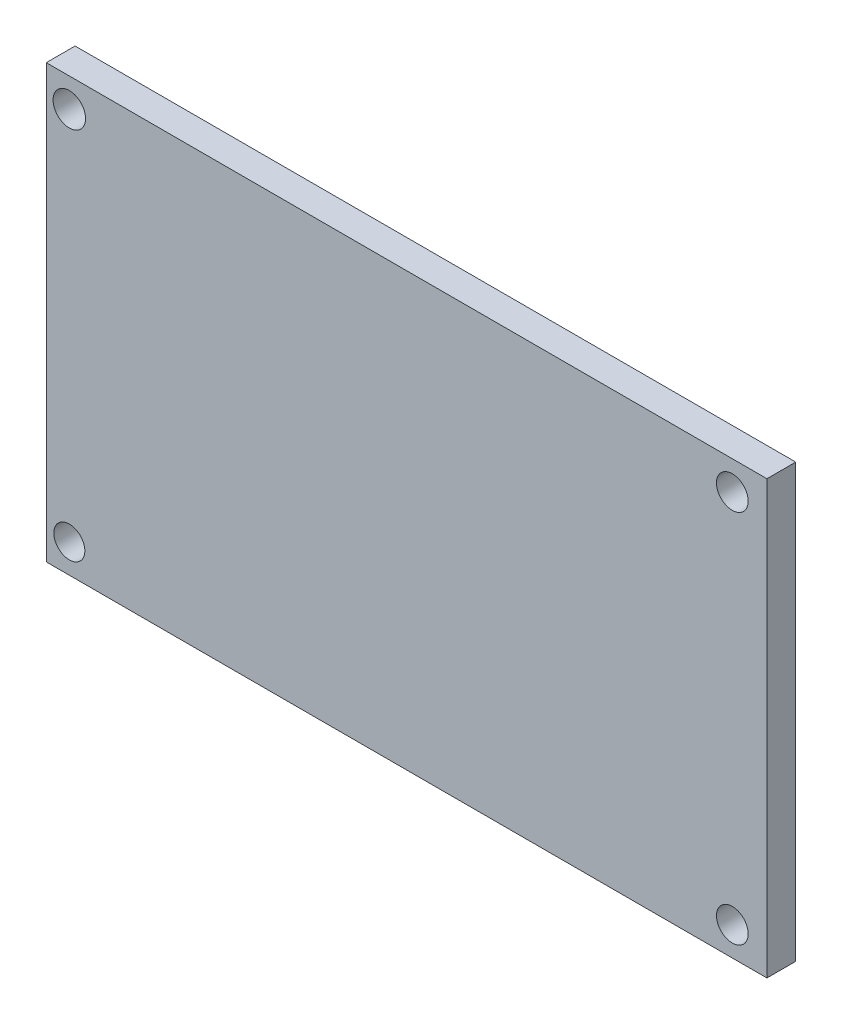
ISO-10303-21;
HEADER;
FILE_DESCRIPTION(('STEP AP214'),'2;1');
FILE_NAME('part.step','',(''),(''),'','','');
FILE_SCHEMA(('AUTOMOTIVE_DESIGN { 1 0 10303 214 1 1 1 1 }'));
ENDSEC;
DATA;
#1=APPLICATION_CONTEXT('core data for automotive mechanical design processes');
#2=APPLICATION_PROTOCOL_DEFINITION('international standard','automotive_design',2000,#1);
#3=PRODUCT_CONTEXT('',#1,'mechanical');
#4=PRODUCT('Part','Part','',(#3));
#5=PRODUCT_RELATED_PRODUCT_CATEGORY('part','',(#4));
#6=PRODUCT_DEFINITION_FORMATION('','',#4);
#7=PRODUCT_DEFINITION_CONTEXT('part definition',#1,'design');
#8=PRODUCT_DEFINITION('design','',#6,#7);
#9=PRODUCT_DEFINITION_SHAPE('','',#8);
#10=(LENGTH_UNIT() NAMED_UNIT(*) SI_UNIT(.MILLI.,.METRE.));
#11=(NAMED_UNIT(*) PLANE_ANGLE_UNIT() SI_UNIT($,.RADIAN.));
#12=(NAMED_UNIT(*) SI_UNIT($,.STERADIAN.) SOLID_ANGLE_UNIT());
#13=UNCERTAINTY_MEASURE_WITH_UNIT(LENGTH_MEASURE(1.E-05),#10,'distance_accuracy_value','');
#14=(GEOMETRIC_REPRESENTATION_CONTEXT(3) GLOBAL_UNCERTAINTY_ASSIGNED_CONTEXT((#13)) GLOBAL_UNIT_ASSIGNED_CONTEXT((#10,
#11,#12)) REPRESENTATION_CONTEXT('',''));
#15=CARTESIAN_POINT('',(0.,0.,0.));
#16=DIRECTION('',(0.,0.,1.));
#17=DIRECTION('',(1.,0.,0.));
#18=AXIS2_PLACEMENT_3D('',#15,#16,#17);
#19=CARTESIAN_POINT('',(-55.0629370629371,24.6451048951049,5.08));
#20=DIRECTION('',(1.,0.,0.));
#21=DIRECTION('',(0.,1.,0.));
#22=AXIS2_PLACEMENT_3D('',#19,#20,#21);
#23=PLANE('',#22);
#24=DIRECTION('',(0.,-1.,0.));
#25=VECTOR('',#24,1.);
#26=CARTESIAN_POINT('',(-55.0629370629371,24.6451048951049,0.));
#27=LINE('',#26,#25);
#28=CARTESIAN_POINT('',(-55.0629370629371,24.6451048951049,0.));
#29=VERTEX_POINT('',#28);
#30=CARTESIAN_POINT('',(-55.0629370629371,-51.5548951048951,0.));
#31=VERTEX_POINT('',#30);
#32=EDGE_CURVE('E1157',#29,#31,#27,.T.);
#33=ORIENTED_EDGE('',*,*,#32,.T.);
#34=DIRECTION('',(0.,0.,-1.));
#35=VECTOR('',#34,1.);
#36=CARTESIAN_POINT('',(-55.0629370629371,-51.5548951048951,5.08));
#37=LINE('',#36,#35);
#38=CARTESIAN_POINT('',(-55.0629370629371,-51.5548951048951,5.08));
#39=VERTEX_POINT('',#38);
#40=EDGE_CURVE('E12',#39,#31,#37,.T.);
#41=ORIENTED_EDGE('',*,*,#40,.F.);
#42=DIRECTION('',(0.,-1.,0.));
#43=VECTOR('',#42,1.);
#44=CARTESIAN_POINT('',(-55.0629370629371,24.6451048951049,5.08));
#45=LINE('',#44,#43);
#46=CARTESIAN_POINT('',(-55.0629370629371,24.6451048951049,5.08));
#47=VERTEX_POINT('',#46);
#48=EDGE_CURVE('E1145',#47,#39,#45,.T.);
#49=ORIENTED_EDGE('',*,*,#48,.F.);
#50=DIRECTION('',(0.,0.,-1.));
#51=VECTOR('',#50,1.);
#52=CARTESIAN_POINT('',(-55.0629370629371,24.6451048951049,5.08));
#53=LINE('',#52,#51);
#54=EDGE_CURVE('E1153',#47,#29,#53,.T.);
#55=ORIENTED_EDGE('',*,*,#54,.T.);
#56=EDGE_LOOP('',(#33,#41,#49,#55));
#57=FACE_BOUND('',#56,.T.);
#58=ADVANCED_FACE('F1093',(#57),#23,.F.);
#59=CARTESIAN_POINT('',(-55.0629370629371,-51.5548951048951,5.08));
#60=DIRECTION('',(0.,1.,0.));
#61=DIRECTION('',(0.,0.,1.));
#62=AXIS2_PLACEMENT_3D('',#59,#60,#61);
#63=PLANE('',#62);
#64=DIRECTION('',(1.,0.,0.));
#65=VECTOR('',#64,1.);
#66=CARTESIAN_POINT('',(-55.0629370629371,-51.5548951048951,0.));
#67=LINE('',#66,#65);
#68=CARTESIAN_POINT('',(71.9370629370629,-51.5548951048951,0.));
#69=VERTEX_POINT('',#68);
#70=EDGE_CURVE('E1149',#31,#69,#67,.T.);
#71=ORIENTED_EDGE('',*,*,#70,.T.);
#72=DIRECTION('',(0.,0.,-1.));
#73=VECTOR('',#72,1.);
#74=CARTESIAN_POINT('',(71.9370629370629,-51.5548951048951,5.08));
#75=LINE('',#74,#73);
#76=CARTESIAN_POINT('',(71.9370629370629,-51.5548951048951,5.08));
#77=VERTEX_POINT('',#76);
#78=EDGE_CURVE('E1101',#77,#69,#75,.T.);
#79=ORIENTED_EDGE('',*,*,#78,.F.);
#80=DIRECTION('',(1.,0.,0.));
#81=VECTOR('',#80,1.);
#82=CARTESIAN_POINT('',(-55.0629370629371,-51.5548951048951,5.08));
#83=LINE('',#82,#81);
#84=EDGE_CURVE('E1139',#39,#77,#83,.T.);
#85=ORIENTED_EDGE('',*,*,#84,.F.);
#86=ORIENTED_EDGE('',*,*,#40,.T.);
#87=EDGE_LOOP('',(#71,#79,#85,#86));
#88=FACE_BOUND('',#87,.T.);
#89=ADVANCED_FACE('F1148',(#88),#63,.F.);
#90=CARTESIAN_POINT('',(71.9370629370629,24.6451048951049,5.08));
#91=DIRECTION('',(-1.,0.,0.));
#92=DIRECTION('',(0.,-1.,0.));
#93=AXIS2_PLACEMENT_3D('',#90,#91,#92);
#94=PLANE('',#93);
#95=DIRECTION('',(0.,1.,0.));
#96=VECTOR('',#95,1.);
#97=CARTESIAN_POINT('',(71.9370629370629,24.6451048951049,0.));
#98=LINE('',#97,#96);
#99=CARTESIAN_POINT('',(71.9370629370629,24.6451048951049,0.));
#100=VERTEX_POINT('',#99);
#101=EDGE_CURVE('E1126',#69,#100,#98,.T.);
#102=ORIENTED_EDGE('',*,*,#101,.T.);
#103=DIRECTION('',(0.,0.,-1.));
#104=VECTOR('',#103,1.);
#105=CARTESIAN_POINT('',(71.9370629370629,24.6451048951049,5.08));
#106=LINE('',#105,#104);
#107=CARTESIAN_POINT('',(71.9370629370629,24.6451048951049,5.08));
#108=VERTEX_POINT('',#107);
#109=EDGE_CURVE('E1150',#108,#100,#106,.T.);
#110=ORIENTED_EDGE('',*,*,#109,.F.);
#111=DIRECTION('',(0.,1.,0.));
#112=VECTOR('',#111,1.);
#113=CARTESIAN_POINT('',(71.9370629370629,24.6451048951049,5.08));
#114=LINE('',#113,#112);
#115=EDGE_CURVE('E1143',#77,#108,#114,.T.);
#116=ORIENTED_EDGE('',*,*,#115,.F.);
#117=ORIENTED_EDGE('',*,*,#78,.T.);
#118=EDGE_LOOP('',(#102,#110,#116,#117));
#119=FACE_BOUND('',#118,.T.);
#120=ADVANCED_FACE('F1151',(#119),#94,.F.);
#121=CARTESIAN_POINT('',(-55.0629370629371,24.6451048951049,5.08));
#122=DIRECTION('',(0.,-1.,0.));
#123=DIRECTION('',(0.,0.,-1.));
#124=AXIS2_PLACEMENT_3D('',#121,#122,#123);
#125=PLANE('',#124);
#126=DIRECTION('',(-1.,0.,0.));
#127=VECTOR('',#126,1.);
#128=CARTESIAN_POINT('',(-55.0629370629371,24.6451048951049,0.));
#129=LINE('',#128,#127);
#130=EDGE_CURVE('E1132',#100,#29,#129,.T.);
#131=ORIENTED_EDGE('',*,*,#130,.T.);
#132=ORIENTED_EDGE('',*,*,#54,.F.);
#133=DIRECTION('',(-1.,0.,0.));
#134=VECTOR('',#133,1.);
#135=CARTESIAN_POINT('',(-55.0629370629371,24.6451048951049,5.08));
#136=LINE('',#135,#134);
#137=EDGE_CURVE('E1109',#108,#47,#136,.T.);
#138=ORIENTED_EDGE('',*,*,#137,.F.);
#139=ORIENTED_EDGE('',*,*,#109,.T.);
#140=EDGE_LOOP('',(#131,#132,#138,#139));
#141=FACE_BOUND('',#140,.T.);
#142=ADVANCED_FACE('F1165',(#141),#125,.F.);
#143=CARTESIAN_POINT('',(0.,0.,5.08));
#144=DIRECTION('',(0.,0.,1.));
#145=DIRECTION('',(1.,0.,0.));
#146=AXIS2_PLACEMENT_3D('',#143,#144,#145);
#147=PLANE('',#146);
#148=ORIENTED_EDGE('',*,*,#48,.T.);
#149=ORIENTED_EDGE('',*,*,#84,.T.);
#150=ORIENTED_EDGE('',*,*,#115,.T.);
#151=ORIENTED_EDGE('',*,*,#137,.T.);
#152=EDGE_LOOP('',(#148,#149,#150,#151));
#153=FACE_BOUND('',#152,.T.);
#154=CARTESIAN_POINT('',(-50.9990197935595,-46.4748951048951,5.08));
#155=DIRECTION('',(0.,0.,1.));
#156=DIRECTION('',(1.,0.,0.));
#157=AXIS2_PLACEMENT_3D('',#154,#155,#156);
#158=CIRCLE('',#157,2.73474797143891);
#159=CARTESIAN_POINT('',(-48.2642718221206,-46.4748951048951,5.08));
#160=VERTEX_POINT('',#159);
#161=EDGE_CURVE('E1160',#160,#160,#158,.F.);
#162=ORIENTED_EDGE('',*,*,#161,.T.);
#163=EDGE_LOOP('',(#162));
#164=FACE_BOUND('',#163,.T.);
#165=CARTESIAN_POINT('',(-50.9990197935595,19.5651048951049,5.08));
#166=DIRECTION('',(0.,0.,1.));
#167=DIRECTION('',(1.,0.,0.));
#168=AXIS2_PLACEMENT_3D('',#165,#166,#167);
#169=CIRCLE('',#168,2.86041509709569);
#170=CARTESIAN_POINT('',(-48.1386046964639,19.5651048951049,5.08));
#171=VERTEX_POINT('',#170);
#172=EDGE_CURVE('E1182',#171,#171,#169,.F.);
#173=ORIENTED_EDGE('',*,*,#172,.T.);
#174=EDGE_LOOP('',(#173));
#175=FACE_BOUND('',#174,.T.);
#176=CARTESIAN_POINT('',(65.8409802064404,19.5651048951049,5.08));
#177=DIRECTION('',(0.,0.,1.));
#178=DIRECTION('',(1.,0.,0.));
#179=AXIS2_PLACEMENT_3D('',#176,#177,#178);
#180=CIRCLE('',#179,2.79400000000001);
#181=CARTESIAN_POINT('',(68.6349802064404,19.5651048951049,5.08));
#182=VERTEX_POINT('',#181);
#183=EDGE_CURVE('E1179',#182,#182,#180,.F.);
#184=ORIENTED_EDGE('',*,*,#183,.T.);
#185=EDGE_LOOP('',(#184));
#186=FACE_BOUND('',#185,.T.);
#187=CARTESIAN_POINT('',(65.8409802064404,-46.4748951048951,5.08));
#188=DIRECTION('',(0.,0.,1.));
#189=DIRECTION('',(1.,0.,0.));
#190=AXIS2_PLACEMENT_3D('',#187,#188,#189);
#191=CIRCLE('',#190,2.79422120883974);
#192=CARTESIAN_POINT('',(68.6352014152802,-46.4748951048951,5.08));
#193=VERTEX_POINT('',#192);
#194=EDGE_CURVE('E1176',#193,#193,#191,.F.);
#195=ORIENTED_EDGE('',*,*,#194,.T.);
#196=EDGE_LOOP('',(#195));
#197=FACE_BOUND('',#196,.T.);
#198=ADVANCED_FACE('F1140',(#153,#164,#175,#186,#197),#147,.T.);
#199=CARTESIAN_POINT('',(0.,0.,0.));
#200=DIRECTION('',(0.,0.,1.));
#201=DIRECTION('',(1.,0.,0.));
#202=AXIS2_PLACEMENT_3D('',#199,#200,#201);
#203=PLANE('',#202);
#204=CARTESIAN_POINT('',(65.8409802064404,-46.4748951048951,0.));
#205=DIRECTION('',(0.,0.,1.));
#206=DIRECTION('',(1.,0.,0.));
#207=AXIS2_PLACEMENT_3D('',#204,#205,#206);
#208=CIRCLE('',#207,2.79422120883974);
#209=CARTESIAN_POINT('',(68.6352014152802,-46.4748951048951,0.));
#210=VERTEX_POINT('',#209);
#211=EDGE_CURVE('E1185',#210,#210,#208,.T.);
#212=ORIENTED_EDGE('',*,*,#211,.T.);
#213=EDGE_LOOP('',(#212));
#214=FACE_BOUND('',#213,.T.);
#215=CARTESIAN_POINT('',(65.8409802064404,19.5651048951049,0.));
#216=DIRECTION('',(0.,0.,1.));
#217=DIRECTION('',(1.,0.,0.));
#218=AXIS2_PLACEMENT_3D('',#215,#216,#217);
#219=CIRCLE('',#218,2.79400000000001);
#220=CARTESIAN_POINT('',(68.6349802064404,19.5651048951049,0.));
#221=VERTEX_POINT('',#220);
#222=EDGE_CURVE('E1189',#221,#221,#219,.T.);
#223=ORIENTED_EDGE('',*,*,#222,.T.);
#224=EDGE_LOOP('',(#223));
#225=FACE_BOUND('',#224,.T.);
#226=CARTESIAN_POINT('',(-50.9990197935595,19.5651048951049,0.));
#227=DIRECTION('',(0.,0.,1.));
#228=DIRECTION('',(1.,0.,0.));
#229=AXIS2_PLACEMENT_3D('',#226,#227,#228);
#230=CIRCLE('',#229,2.86041509709569);
#231=CARTESIAN_POINT('',(-48.1386046964639,19.5651048951049,0.));
#232=VERTEX_POINT('',#231);
#233=EDGE_CURVE('E1186',#232,#232,#230,.T.);
#234=ORIENTED_EDGE('',*,*,#233,.T.);
#235=EDGE_LOOP('',(#234));
#236=FACE_BOUND('',#235,.T.);
#237=CARTESIAN_POINT('',(-50.9990197935595,-46.4748951048951,0.));
#238=DIRECTION('',(0.,0.,1.));
#239=DIRECTION('',(1.,0.,0.));
#240=AXIS2_PLACEMENT_3D('',#237,#238,#239);
#241=CIRCLE('',#240,2.73474797143891);
#242=CARTESIAN_POINT('',(-48.2642718221206,-46.4748951048951,0.));
#243=VERTEX_POINT('',#242);
#244=EDGE_CURVE('E1173',#243,#243,#241,.T.);
#245=ORIENTED_EDGE('',*,*,#244,.T.);
#246=EDGE_LOOP('',(#245));
#247=FACE_BOUND('',#246,.T.);
#248=ORIENTED_EDGE('',*,*,#32,.F.);
#249=ORIENTED_EDGE('',*,*,#130,.F.);
#250=ORIENTED_EDGE('',*,*,#101,.F.);
#251=ORIENTED_EDGE('',*,*,#70,.F.);
#252=EDGE_LOOP('',(#248,#249,#250,#251));
#253=FACE_BOUND('',#252,.T.);
#254=ADVANCED_FACE('F1168',(#214,#225,#236,#247,#253),#203,.F.);
#255=CARTESIAN_POINT('',(-50.9990197935595,-46.4748951048951,7.62));
#256=DIRECTION('',(0.,0.,-1.));
#257=DIRECTION('',(-1.,0.,0.));
#258=AXIS2_PLACEMENT_3D('',#255,#256,#257);
#259=CYLINDRICAL_SURFACE('',#258,2.73474797143891);
#260=ORIENTED_EDGE('',*,*,#161,.F.);
#261=EDGE_LOOP('',(#260));
#262=FACE_BOUND('',#261,.T.);
#263=ORIENTED_EDGE('',*,*,#244,.F.);
#264=EDGE_LOOP('',(#263));
#265=FACE_BOUND('',#264,.T.);
#266=ADVANCED_FACE('F1222',(#262,#265),#259,.F.);
#267=CARTESIAN_POINT('',(-50.9990197935595,19.5651048951049,7.62));
#268=DIRECTION('',(0.,0.,-1.));
#269=DIRECTION('',(-1.,0.,0.));
#270=AXIS2_PLACEMENT_3D('',#267,#268,#269);
#271=CYLINDRICAL_SURFACE('',#270,2.86041509709569);
#272=ORIENTED_EDGE('',*,*,#172,.F.);
#273=EDGE_LOOP('',(#272));
#274=FACE_BOUND('',#273,.T.);
#275=ORIENTED_EDGE('',*,*,#233,.F.);
#276=EDGE_LOOP('',(#275));
#277=FACE_BOUND('',#276,.T.);
#278=ADVANCED_FACE('F1205',(#274,#277),#271,.F.);
#279=CARTESIAN_POINT('',(65.8409802064404,19.5651048951049,7.62));
#280=DIRECTION('',(0.,0.,-1.));
#281=DIRECTION('',(-1.,0.,0.));
#282=AXIS2_PLACEMENT_3D('',#279,#280,#281);
#283=CYLINDRICAL_SURFACE('',#282,2.79400000000001);
#284=ORIENTED_EDGE('',*,*,#183,.F.);
#285=EDGE_LOOP('',(#284));
#286=FACE_BOUND('',#285,.T.);
#287=ORIENTED_EDGE('',*,*,#222,.F.);
#288=EDGE_LOOP('',(#287));
#289=FACE_BOUND('',#288,.T.);
#290=ADVANCED_FACE('F1199',(#286,#289),#283,.F.);
#291=CARTESIAN_POINT('',(65.8409802064404,-46.4748951048951,7.62));
#292=DIRECTION('',(0.,0.,-1.));
#293=DIRECTION('',(-1.,0.,0.));
#294=AXIS2_PLACEMENT_3D('',#291,#292,#293);
#295=CYLINDRICAL_SURFACE('',#294,2.79422120883974);
#296=ORIENTED_EDGE('',*,*,#194,.F.);
#297=EDGE_LOOP('',(#296));
#298=FACE_BOUND('',#297,.T.);
#299=ORIENTED_EDGE('',*,*,#211,.F.);
#300=EDGE_LOOP('',(#299));
#301=FACE_BOUND('',#300,.T.);
#302=ADVANCED_FACE('F1197',(#298,#301),#295,.F.);
#303=CLOSED_SHELL('',(#58,#89,#120,#142,#198,#254,#266,#278,#290,#302));
#304=MANIFOLD_SOLID_BREP('B2',#303);
#305=ADVANCED_BREP_SHAPE_REPRESENTATION('',(#18,#304),#14);
#306=SHAPE_DEFINITION_REPRESENTATION(#9,#305);
ENDSEC;
END-ISO-10303-21;
